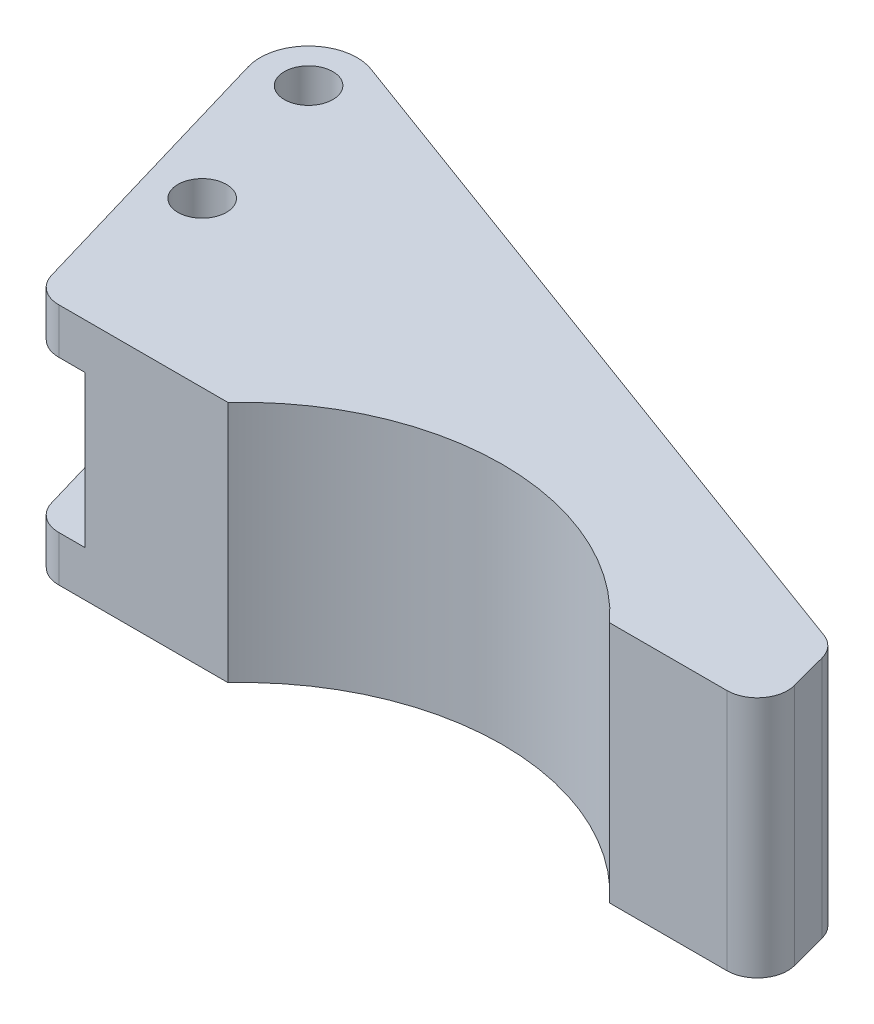
ISO-10303-21;
HEADER;
FILE_DESCRIPTION(('STEP AP214'),'2;1');
FILE_NAME('part.step','',(''),(''),'','','');
FILE_SCHEMA(('AUTOMOTIVE_DESIGN { 1 0 10303 214 1 1 1 1 }'));
ENDSEC;
DATA;
#1=APPLICATION_CONTEXT('core data for automotive mechanical design processes');
#2=APPLICATION_PROTOCOL_DEFINITION('international standard','automotive_design',2000,#1);
#3=PRODUCT_CONTEXT('',#1,'mechanical');
#4=PRODUCT('Part','Part','',(#3));
#5=PRODUCT_RELATED_PRODUCT_CATEGORY('part','',(#4));
#6=PRODUCT_DEFINITION_FORMATION('','',#4);
#7=PRODUCT_DEFINITION_CONTEXT('part definition',#1,'design');
#8=PRODUCT_DEFINITION('design','',#6,#7);
#9=PRODUCT_DEFINITION_SHAPE('','',#8);
#10=(LENGTH_UNIT() NAMED_UNIT(*) SI_UNIT(.MILLI.,.METRE.));
#11=(NAMED_UNIT(*) PLANE_ANGLE_UNIT() SI_UNIT($,.RADIAN.));
#12=(NAMED_UNIT(*) SI_UNIT($,.STERADIAN.) SOLID_ANGLE_UNIT());
#13=UNCERTAINTY_MEASURE_WITH_UNIT(LENGTH_MEASURE(1.E-05),#10,'distance_accuracy_value','');
#14=(GEOMETRIC_REPRESENTATION_CONTEXT(3) GLOBAL_UNCERTAINTY_ASSIGNED_CONTEXT((#13)) GLOBAL_UNIT_ASSIGNED_CONTEXT((#10,
#11,#12)) REPRESENTATION_CONTEXT('',''));
#15=CARTESIAN_POINT('',(0.,0.,0.));
#16=DIRECTION('',(0.,0.,1.));
#17=DIRECTION('',(1.,0.,0.));
#18=AXIS2_PLACEMENT_3D('',#15,#16,#17);
#19=CARTESIAN_POINT('',(0.,20.,0.));
#20=DIRECTION('',(0.,-1.,0.));
#21=DIRECTION('',(0.,0.,-1.));
#22=AXIS2_PLACEMENT_3D('',#19,#20,#21);
#23=CYLINDRICAL_SURFACE('',#22,8.);
#24=CARTESIAN_POINT('',(0.,-12.5,0.));
#25=DIRECTION('',(0.,-1.,0.));
#26=DIRECTION('',(0.,0.,-1.));
#27=AXIS2_PLACEMENT_3D('',#24,#25,#26);
#28=CIRCLE('',#27,8.);
#29=CARTESIAN_POINT('',(-7.67348841198962,-12.5,2.26220591261295));
#30=VERTEX_POINT('',#29);
#31=CARTESIAN_POINT('',(2.76333213161237,-12.5,-7.50759585555846));
#32=VERTEX_POINT('',#31);
#33=EDGE_CURVE('E228',#30,#32,#28,.T.);
#34=ORIENTED_EDGE('',*,*,#33,.T.);
#35=DIRECTION('',(0.,-1.,0.));
#36=VECTOR('',#35,1.);
#37=CARTESIAN_POINT('',(2.76333213161237,20.,-7.50759585555846));
#38=LINE('',#37,#36);
#39=CARTESIAN_POINT('',(2.76333213161237,-20.,-7.50759585555846));
#40=VERTEX_POINT('',#39);
#41=EDGE_CURVE('E100',#32,#40,#38,.T.);
#42=ORIENTED_EDGE('',*,*,#41,.T.);
#43=CARTESIAN_POINT('',(0.,-20.,0.));
#44=DIRECTION('',(0.,1.,0.));
#45=DIRECTION('',(0.,0.,-1.));
#46=AXIS2_PLACEMENT_3D('',#43,#44,#45);
#47=CIRCLE('',#46,8.);
#48=CARTESIAN_POINT('',(-7.67348841198962,-20.,2.26220591261295));
#49=VERTEX_POINT('',#48);
#50=EDGE_CURVE('E159',#40,#49,#47,.T.);
#51=ORIENTED_EDGE('',*,*,#50,.T.);
#52=DIRECTION('',(0.,-1.,0.));
#53=VECTOR('',#52,1.);
#54=CARTESIAN_POINT('',(-7.67348841198962,20.,2.26220591261295));
#55=LINE('',#54,#53);
#56=EDGE_CURVE('E204',#30,#49,#55,.T.);
#57=ORIENTED_EDGE('',*,*,#56,.F.);
#58=EDGE_LOOP('',(#34,#42,#51,#57));
#59=FACE_BOUND('',#58,.T.);
#60=ADVANCED_FACE('F36',(#59),#23,.T.);
#61=CARTESIAN_POINT('',(-7.67348841198962,20.,2.26220591261295));
#62=DIRECTION('',(0.959186051498703,0.,-0.282775739076619));
#63=DIRECTION('',(-0.282775739076619,0.,-0.959186051498703));
#64=AXIS2_PLACEMENT_3D('',#61,#62,#63);
#65=PLANE('',#64);
#66=CARTESIAN_POINT('',(-7.67348841198962,20.,2.26220591261295));
#67=VERTEX_POINT('',#66);
#68=CARTESIAN_POINT('',(-7.67348841198962,12.5,2.26220591261295));
#69=VERTEX_POINT('',#68);
#70=EDGE_CURVE('E44',#67,#69,#55,.T.);
#71=ORIENTED_EDGE('',*,*,#70,.T.);
#72=DIRECTION('',(0.282775739076619,0.,0.959186051498703));
#73=VECTOR('',#72,1.);
#74=CARTESIAN_POINT('',(-7.67348841198962,12.5,2.26220591261295));
#75=LINE('',#74,#73);
#76=CARTESIAN_POINT('',(5.89406974250649,12.5,48.2838786953831));
#77=VERTEX_POINT('',#76);
#78=EDGE_CURVE('E237',#69,#77,#75,.T.);
#79=ORIENTED_EDGE('',*,*,#78,.T.);
#80=DIRECTION('',(0.,-1.,0.));
#81=VECTOR('',#80,1.);
#82=CARTESIAN_POINT('',(5.89406974250649,20.,48.2838786953831));
#83=LINE('',#82,#81);
#84=CARTESIAN_POINT('',(5.89406974250649,20.,48.2838786953831));
#85=VERTEX_POINT('',#84);
#86=EDGE_CURVE('E201',#85,#77,#83,.T.);
#87=ORIENTED_EDGE('',*,*,#86,.F.);
#88=DIRECTION('',(0.282775739076619,0.,0.959186051498703));
#89=VECTOR('',#88,1.);
#90=CARTESIAN_POINT('',(-7.67348841198962,20.,2.26220591261295));
#91=LINE('',#90,#89);
#92=EDGE_CURVE('E109',#67,#85,#91,.T.);
#93=ORIENTED_EDGE('',*,*,#92,.F.);
#94=EDGE_LOOP('',(#71,#79,#87,#93));
#95=FACE_BOUND('',#94,.T.);
#96=ADVANCED_FACE('F287',(#95),#65,.F.);
#97=CARTESIAN_POINT('',(10.69,20.,46.87));
#98=DIRECTION('',(0.,-1.,0.));
#99=DIRECTION('',(0.,0.,-1.));
#100=AXIS2_PLACEMENT_3D('',#97,#98,#99);
#101=CYLINDRICAL_SURFACE('',#100,5.);
#102=ORIENTED_EDGE('',*,*,#86,.T.);
#103=CARTESIAN_POINT('',(10.69,12.5,46.87));
#104=DIRECTION('',(0.,1.,0.));
#105=DIRECTION('',(0.,0.,1.));
#106=AXIS2_PLACEMENT_3D('',#103,#104,#105);
#107=CIRCLE('',#106,5.);
#108=CARTESIAN_POINT('',(10.69,12.5,51.87));
#109=VERTEX_POINT('',#108);
#110=EDGE_CURVE('E240',#77,#109,#107,.T.);
#111=ORIENTED_EDGE('',*,*,#110,.T.);
#112=DIRECTION('',(0.,-1.,0.));
#113=VECTOR('',#112,1.);
#114=CARTESIAN_POINT('',(10.69,20.,51.87));
#115=LINE('',#114,#113);
#116=CARTESIAN_POINT('',(10.69,20.,51.87));
#117=VERTEX_POINT('',#116);
#118=EDGE_CURVE('E197',#117,#109,#115,.T.);
#119=ORIENTED_EDGE('',*,*,#118,.F.);
#120=CARTESIAN_POINT('',(10.69,20.,46.87));
#121=DIRECTION('',(0.,1.,0.));
#122=DIRECTION('',(0.,0.,1.));
#123=AXIS2_PLACEMENT_3D('',#120,#121,#122);
#124=CIRCLE('',#123,5.);
#125=EDGE_CURVE('E256',#85,#117,#124,.T.);
#126=ORIENTED_EDGE('',*,*,#125,.F.);
#127=EDGE_LOOP('',(#102,#111,#119,#126));
#128=FACE_BOUND('',#127,.T.);
#129=ADVANCED_FACE('F290',(#128),#101,.T.);
#130=CARTESIAN_POINT('',(0.,20.,0.));
#131=DIRECTION('',(0.,-1.,0.));
#132=DIRECTION('',(0.,0.,-1.));
#133=AXIS2_PLACEMENT_3D('',#130,#131,#132);
#134=CYLINDRICAL_SURFACE('',#133,4.);
#135=CARTESIAN_POINT('',(0.,12.5,0.));
#136=DIRECTION('',(0.,1.,0.));
#137=DIRECTION('',(0.,0.,1.));
#138=AXIS2_PLACEMENT_3D('',#135,#136,#137);
#139=CIRCLE('',#138,4.);
#140=CARTESIAN_POINT('',(0.,12.5,4.));
#141=VERTEX_POINT('',#140);
#142=EDGE_CURVE('E212',#141,#141,#139,.T.);
#143=ORIENTED_EDGE('',*,*,#142,.F.);
#144=EDGE_LOOP('',(#143));
#145=FACE_BOUND('',#144,.T.);
#146=CARTESIAN_POINT('',(0.,20.,0.));
#147=DIRECTION('',(0.,1.,0.));
#148=DIRECTION('',(0.,0.,1.));
#149=AXIS2_PLACEMENT_3D('',#146,#147,#148);
#150=CIRCLE('',#149,4.);
#151=CARTESIAN_POINT('',(0.,20.,4.));
#152=VERTEX_POINT('',#151);
#153=EDGE_CURVE('E162',#152,#152,#150,.T.);
#154=ORIENTED_EDGE('',*,*,#153,.T.);
#155=EDGE_LOOP('',(#154));
#156=FACE_BOUND('',#155,.T.);
#157=ADVANCED_FACE('F396',(#145,#156),#134,.F.);
#158=CARTESIAN_POINT('',(7.33,20.,24.87));
#159=DIRECTION('',(0.,-1.,0.));
#160=DIRECTION('',(0.,0.,-1.));
#161=AXIS2_PLACEMENT_3D('',#158,#159,#160);
#162=CYLINDRICAL_SURFACE('',#161,4.);
#163=CARTESIAN_POINT('',(7.33,12.5,24.87));
#164=DIRECTION('',(0.,1.,0.));
#165=DIRECTION('',(0.,0.,1.));
#166=AXIS2_PLACEMENT_3D('',#163,#164,#165);
#167=CIRCLE('',#166,4.);
#168=CARTESIAN_POINT('',(7.33,12.5,28.87));
#169=VERTEX_POINT('',#168);
#170=EDGE_CURVE('E210',#169,#169,#167,.T.);
#171=ORIENTED_EDGE('',*,*,#170,.F.);
#172=EDGE_LOOP('',(#171));
#173=FACE_BOUND('',#172,.T.);
#174=CARTESIAN_POINT('',(7.33,20.,24.87));
#175=DIRECTION('',(0.,1.,0.));
#176=DIRECTION('',(0.,0.,1.));
#177=AXIS2_PLACEMENT_3D('',#174,#175,#176);
#178=CIRCLE('',#177,4.);
#179=CARTESIAN_POINT('',(7.33,20.,28.87));
#180=VERTEX_POINT('',#179);
#181=EDGE_CURVE('E244',#180,#180,#178,.T.);
#182=ORIENTED_EDGE('',*,*,#181,.T.);
#183=EDGE_LOOP('',(#182));
#184=FACE_BOUND('',#183,.T.);
#185=ADVANCED_FACE('F373',(#173,#184),#162,.F.);
#186=CARTESIAN_POINT('',(0.,20.,0.));
#187=DIRECTION('',(0.,-1.,0.));
#188=DIRECTION('',(0.,0.,-1.));
#189=AXIS2_PLACEMENT_3D('',#186,#187,#188);
#190=PLANE('',#189);
#191=CARTESIAN_POINT('',(0.,20.,0.));
#192=DIRECTION('',(0.,1.,0.));
#193=DIRECTION('',(0.,0.,-1.));
#194=AXIS2_PLACEMENT_3D('',#191,#192,#193);
#195=CIRCLE('',#194,8.);
#196=CARTESIAN_POINT('',(2.76333213161237,20.,-7.50759585555846));
#197=VERTEX_POINT('',#196);
#198=EDGE_CURVE('E181',#197,#67,#195,.T.);
#199=ORIENTED_EDGE('',*,*,#198,.T.);
#200=ORIENTED_EDGE('',*,*,#92,.T.);
#201=ORIENTED_EDGE('',*,*,#125,.T.);
#202=DIRECTION('',(1.,0.,0.));
#203=VECTOR('',#202,1.);
#204=CARTESIAN_POINT('',(10.69,20.,51.87));
#205=LINE('',#204,#203);
#206=CARTESIAN_POINT('',(38.5852070424872,20.,51.87));
#207=VERTEX_POINT('',#206);
#208=EDGE_CURVE('E258',#117,#207,#205,.T.);
#209=ORIENTED_EDGE('',*,*,#208,.T.);
#210=CARTESIAN_POINT('',(70.04,20.,80.88));
#211=DIRECTION('',(0.,-1.,0.));
#212=DIRECTION('',(0.,0.,-1.));
#213=AXIS2_PLACEMENT_3D('',#210,#211,#212);
#214=CIRCLE('',#213,42.79);
#215=CARTESIAN_POINT('',(101.494792957513,20.,51.87));
#216=VERTEX_POINT('',#215);
#217=EDGE_CURVE('E260',#207,#216,#214,.T.);
#218=ORIENTED_EDGE('',*,*,#217,.T.);
#219=DIRECTION('',(1.,0.,0.));
#220=VECTOR('',#219,1.);
#221=CARTESIAN_POINT('',(101.494792957513,20.,51.87));
#222=LINE('',#221,#220);
#223=CARTESIAN_POINT('',(120.83,20.,51.87));
#224=VERTEX_POINT('',#223);
#225=EDGE_CURVE('E262',#216,#224,#222,.T.);
#226=ORIENTED_EDGE('',*,*,#225,.T.);
#227=CARTESIAN_POINT('',(120.83,20.,46.87));
#228=DIRECTION('',(0.,1.,0.));
#229=DIRECTION('',(0.,0.,1.));
#230=AXIS2_PLACEMENT_3D('',#227,#228,#229);
#231=CIRCLE('',#230,5.00000000000001);
#232=CARTESIAN_POINT('',(125.661820832769,20.,45.584112197731));
#233=VERTEX_POINT('',#232);
#234=EDGE_CURVE('E138',#224,#233,#231,.T.);
#235=ORIENTED_EDGE('',*,*,#234,.T.);
#236=DIRECTION('',(-0.257177560453807,0.,-0.966364166553701));
#237=VECTOR('',#236,1.);
#238=CARTESIAN_POINT('',(125.661820832769,20.,45.584112197731));
#239=LINE('',#238,#237);
#240=CARTESIAN_POINT('',(124.011820832769,20.,39.384112197731));
#241=VERTEX_POINT('',#240);
#242=EDGE_CURVE('E130',#233,#241,#239,.T.);
#243=ORIENTED_EDGE('',*,*,#242,.T.);
#244=CARTESIAN_POINT('',(119.18,20.,40.67));
#245=DIRECTION('',(0.,1.,0.));
#246=DIRECTION('',(0.,0.,1.));
#247=AXIS2_PLACEMENT_3D('',#244,#245,#246);
#248=CIRCLE('',#247,5.00000000000002);
#249=CARTESIAN_POINT('',(120.907082582258,20.,35.9777525902759));
#250=VERTEX_POINT('',#249);
#251=EDGE_CURVE('E135',#241,#250,#248,.T.);
#252=ORIENTED_EDGE('',*,*,#251,.T.);
#253=DIRECTION('',(-0.938449481944808,0.,-0.345416516451547));
#254=VECTOR('',#253,1.);
#255=CARTESIAN_POINT('',(120.907082582258,20.,35.977752590276));
#256=LINE('',#255,#254);
#257=EDGE_CURVE('E60',#250,#197,#256,.T.);
#258=ORIENTED_EDGE('',*,*,#257,.T.);
#259=EDGE_LOOP('',(#199,#200,#201,#209,#218,#226,#235,#243,#252,#258));
#260=FACE_BOUND('',#259,.T.);
#261=ORIENTED_EDGE('',*,*,#153,.F.);
#262=EDGE_LOOP('',(#261));
#263=FACE_BOUND('',#262,.T.);
#264=ORIENTED_EDGE('',*,*,#181,.F.);
#265=EDGE_LOOP('',(#264));
#266=FACE_BOUND('',#265,.T.);
#267=ADVANCED_FACE('F132',(#260,#263,#266),#190,.F.);
#268=CARTESIAN_POINT('',(0.,-20.,0.));
#269=DIRECTION('',(0.,-1.,0.));
#270=DIRECTION('',(0.,0.,-1.));
#271=AXIS2_PLACEMENT_3D('',#268,#269,#270);
#272=PLANE('',#271);
#273=CARTESIAN_POINT('',(0.,-20.,0.));
#274=DIRECTION('',(0.,1.,0.));
#275=DIRECTION('',(0.,0.,1.));
#276=AXIS2_PLACEMENT_3D('',#273,#274,#275);
#277=CIRCLE('',#276,4.);
#278=CARTESIAN_POINT('',(0.,-20.,4.));
#279=VERTEX_POINT('',#278);
#280=EDGE_CURVE('E247',#279,#279,#277,.T.);
#281=ORIENTED_EDGE('',*,*,#280,.T.);
#282=EDGE_LOOP('',(#281));
#283=FACE_BOUND('',#282,.T.);
#284=ORIENTED_EDGE('',*,*,#50,.F.);
#285=DIRECTION('',(-0.938449481944808,0.,-0.345416516451547));
#286=VECTOR('',#285,1.);
#287=CARTESIAN_POINT('',(120.907082582258,-20.,35.977752590276));
#288=LINE('',#287,#286);
#289=CARTESIAN_POINT('',(120.907082582258,-20.,35.9777525902759));
#290=VERTEX_POINT('',#289);
#291=EDGE_CURVE('E179',#290,#40,#288,.T.);
#292=ORIENTED_EDGE('',*,*,#291,.F.);
#293=CARTESIAN_POINT('',(119.18,-20.,40.67));
#294=DIRECTION('',(0.,1.,0.));
#295=DIRECTION('',(0.,0.,1.));
#296=AXIS2_PLACEMENT_3D('',#293,#294,#295);
#297=CIRCLE('',#296,5.00000000000002);
#298=CARTESIAN_POINT('',(124.011820832769,-20.,39.384112197731));
#299=VERTEX_POINT('',#298);
#300=EDGE_CURVE('E177',#299,#290,#297,.T.);
#301=ORIENTED_EDGE('',*,*,#300,.F.);
#302=DIRECTION('',(-0.257177560453807,0.,-0.966364166553701));
#303=VECTOR('',#302,1.);
#304=CARTESIAN_POINT('',(125.661820832769,-20.,45.584112197731));
#305=LINE('',#304,#303);
#306=CARTESIAN_POINT('',(125.661820832769,-20.,45.584112197731));
#307=VERTEX_POINT('',#306);
#308=EDGE_CURVE('E147',#307,#299,#305,.T.);
#309=ORIENTED_EDGE('',*,*,#308,.F.);
#310=CARTESIAN_POINT('',(120.83,-20.,46.87));
#311=DIRECTION('',(0.,1.,0.));
#312=DIRECTION('',(0.,0.,1.));
#313=AXIS2_PLACEMENT_3D('',#310,#311,#312);
#314=CIRCLE('',#313,5.00000000000001);
#315=CARTESIAN_POINT('',(120.83,-20.,51.87));
#316=VERTEX_POINT('',#315);
#317=EDGE_CURVE('E174',#316,#307,#314,.T.);
#318=ORIENTED_EDGE('',*,*,#317,.F.);
#319=DIRECTION('',(1.,0.,0.));
#320=VECTOR('',#319,1.);
#321=CARTESIAN_POINT('',(101.494792957513,-20.,51.87));
#322=LINE('',#321,#320);
#323=CARTESIAN_POINT('',(101.494792957513,-20.,51.87));
#324=VERTEX_POINT('',#323);
#325=EDGE_CURVE('E172',#324,#316,#322,.T.);
#326=ORIENTED_EDGE('',*,*,#325,.F.);
#327=CARTESIAN_POINT('',(70.04,-20.,80.88));
#328=DIRECTION('',(0.,-1.,0.));
#329=DIRECTION('',(0.,0.,-1.));
#330=AXIS2_PLACEMENT_3D('',#327,#328,#329);
#331=CIRCLE('',#330,42.79);
#332=CARTESIAN_POINT('',(38.5852070424872,-20.,51.87));
#333=VERTEX_POINT('',#332);
#334=EDGE_CURVE('E170',#333,#324,#331,.T.);
#335=ORIENTED_EDGE('',*,*,#334,.F.);
#336=DIRECTION('',(1.,0.,0.));
#337=VECTOR('',#336,1.);
#338=CARTESIAN_POINT('',(10.69,-20.,51.87));
#339=LINE('',#338,#337);
#340=CARTESIAN_POINT('',(10.69,-20.,51.87));
#341=VERTEX_POINT('',#340);
#342=EDGE_CURVE('E168',#341,#333,#339,.T.);
#343=ORIENTED_EDGE('',*,*,#342,.F.);
#344=CARTESIAN_POINT('',(10.69,-20.,46.87));
#345=DIRECTION('',(0.,1.,0.));
#346=DIRECTION('',(0.,0.,1.));
#347=AXIS2_PLACEMENT_3D('',#344,#345,#346);
#348=CIRCLE('',#347,5.);
#349=CARTESIAN_POINT('',(5.89406974250649,-20.,48.2838786953831));
#350=VERTEX_POINT('',#349);
#351=EDGE_CURVE('E165',#350,#341,#348,.T.);
#352=ORIENTED_EDGE('',*,*,#351,.F.);
#353=DIRECTION('',(0.282775739076619,0.,0.959186051498703));
#354=VECTOR('',#353,1.);
#355=CARTESIAN_POINT('',(-7.67348841198962,-20.,2.26220591261295));
#356=LINE('',#355,#354);
#357=EDGE_CURVE('E161',#49,#350,#356,.T.);
#358=ORIENTED_EDGE('',*,*,#357,.F.);
#359=EDGE_LOOP('',(#284,#292,#301,#309,#318,#326,#335,#343,#352,#358));
#360=FACE_BOUND('',#359,.T.);
#361=CARTESIAN_POINT('',(7.33,-20.,24.87));
#362=DIRECTION('',(0.,1.,0.));
#363=DIRECTION('',(0.,0.,1.));
#364=AXIS2_PLACEMENT_3D('',#361,#362,#363);
#365=CIRCLE('',#364,4.);
#366=CARTESIAN_POINT('',(7.33,-20.,28.87));
#367=VERTEX_POINT('',#366);
#368=EDGE_CURVE('E243',#367,#367,#365,.T.);
#369=ORIENTED_EDGE('',*,*,#368,.T.);
#370=EDGE_LOOP('',(#369));
#371=FACE_BOUND('',#370,.T.);
#372=ADVANCED_FACE('F275',(#283,#360,#371),#272,.T.);
#373=CARTESIAN_POINT('',(0.,12.5,0.));
#374=DIRECTION('',(0.,1.,0.));
#375=DIRECTION('',(0.,0.,1.));
#376=AXIS2_PLACEMENT_3D('',#373,#374,#375);
#377=CIRCLE('',#376,8.);
#378=CARTESIAN_POINT('',(2.76333213161237,12.5,-7.50759585555846));
#379=VERTEX_POINT('',#378);
#380=EDGE_CURVE('E234',#379,#69,#377,.T.);
#381=ORIENTED_EDGE('',*,*,#380,.T.);
#382=ORIENTED_EDGE('',*,*,#70,.F.);
#383=ORIENTED_EDGE('',*,*,#198,.F.);
#384=EDGE_CURVE('E182',#197,#379,#38,.T.);
#385=ORIENTED_EDGE('',*,*,#384,.T.);
#386=EDGE_LOOP('',(#381,#382,#383,#385));
#387=FACE_BOUND('',#386,.T.);
#388=ADVANCED_FACE('F38',(#387),#23,.T.);
#389=CARTESIAN_POINT('',(5.89406974250649,-12.5,48.2838786953831));
#390=VERTEX_POINT('',#389);
#391=EDGE_CURVE('E200',#390,#350,#83,.T.);
#392=ORIENTED_EDGE('',*,*,#391,.F.);
#393=DIRECTION('',(-0.282775739076619,0.,-0.959186051498703));
#394=VECTOR('',#393,1.);
#395=CARTESIAN_POINT('',(-7.67348841198962,-12.5,2.26220591261295));
#396=LINE('',#395,#394);
#397=EDGE_CURVE('E220',#390,#30,#396,.T.);
#398=ORIENTED_EDGE('',*,*,#397,.T.);
#399=ORIENTED_EDGE('',*,*,#56,.T.);
#400=ORIENTED_EDGE('',*,*,#357,.T.);
#401=EDGE_LOOP('',(#392,#398,#399,#400));
#402=FACE_BOUND('',#401,.T.);
#403=ADVANCED_FACE('F307',(#402),#65,.F.);
#404=CARTESIAN_POINT('',(10.69,-12.5,51.87));
#405=VERTEX_POINT('',#404);
#406=EDGE_CURVE('E196',#405,#341,#115,.T.);
#407=ORIENTED_EDGE('',*,*,#406,.F.);
#408=CARTESIAN_POINT('',(10.69,-12.5,46.87));
#409=DIRECTION('',(0.,-1.,0.));
#410=DIRECTION('',(0.,0.,-1.));
#411=AXIS2_PLACEMENT_3D('',#408,#409,#410);
#412=CIRCLE('',#411,5.);
#413=EDGE_CURVE('E213',#405,#390,#412,.T.);
#414=ORIENTED_EDGE('',*,*,#413,.T.);
#415=ORIENTED_EDGE('',*,*,#391,.T.);
#416=ORIENTED_EDGE('',*,*,#351,.T.);
#417=EDGE_LOOP('',(#407,#414,#415,#416));
#418=FACE_BOUND('',#417,.T.);
#419=ADVANCED_FACE('F304',(#418),#101,.T.);
#420=CARTESIAN_POINT('',(10.69,20.,51.87));
#421=DIRECTION('',(0.,0.,-1.));
#422=DIRECTION('',(-1.,0.,0.));
#423=AXIS2_PLACEMENT_3D('',#420,#421,#422);
#424=PLANE('',#423);
#425=ORIENTED_EDGE('',*,*,#118,.T.);
#426=DIRECTION('',(-1.,0.,0.));
#427=VECTOR('',#426,1.);
#428=CARTESIAN_POINT('',(-8.,12.5,51.87));
#429=LINE('',#428,#427);
#430=CARTESIAN_POINT('',(15.,12.5,51.87));
#431=VERTEX_POINT('',#430);
#432=EDGE_CURVE('E327',#431,#109,#429,.T.);
#433=ORIENTED_EDGE('',*,*,#432,.F.);
#434=DIRECTION('',(0.,1.,0.));
#435=VECTOR('',#434,1.);
#436=CARTESIAN_POINT('',(15.,12.5,51.87));
#437=LINE('',#436,#435);
#438=CARTESIAN_POINT('',(15.,-12.5,51.87));
#439=VERTEX_POINT('',#438);
#440=EDGE_CURVE('E332',#439,#431,#437,.T.);
#441=ORIENTED_EDGE('',*,*,#440,.F.);
#442=DIRECTION('',(1.,0.,0.));
#443=VECTOR('',#442,1.);
#444=CARTESIAN_POINT('',(-8.,-12.5,51.87));
#445=LINE('',#444,#443);
#446=EDGE_CURVE('E335',#405,#439,#445,.T.);
#447=ORIENTED_EDGE('',*,*,#446,.F.);
#448=ORIENTED_EDGE('',*,*,#406,.T.);
#449=ORIENTED_EDGE('',*,*,#342,.T.);
#450=DIRECTION('',(0.,-1.,0.));
#451=VECTOR('',#450,1.);
#452=CARTESIAN_POINT('',(38.5852070424872,20.,51.87));
#453=LINE('',#452,#451);
#454=EDGE_CURVE('E193',#207,#333,#453,.T.);
#455=ORIENTED_EDGE('',*,*,#454,.F.);
#456=ORIENTED_EDGE('',*,*,#208,.F.);
#457=EDGE_LOOP('',(#425,#433,#441,#447,#448,#449,#455,#456));
#458=FACE_BOUND('',#457,.T.);
#459=ADVANCED_FACE('F297',(#458),#424,.F.);
#460=CARTESIAN_POINT('',(70.04,20.,80.88));
#461=DIRECTION('',(0.,-1.,0.));
#462=DIRECTION('',(0.,0.,-1.));
#463=AXIS2_PLACEMENT_3D('',#460,#461,#462);
#464=CYLINDRICAL_SURFACE('',#463,42.79);
#465=ORIENTED_EDGE('',*,*,#334,.T.);
#466=DIRECTION('',(0.,-1.,0.));
#467=VECTOR('',#466,1.);
#468=CARTESIAN_POINT('',(101.494792957513,20.,51.87));
#469=LINE('',#468,#467);
#470=EDGE_CURVE('E190',#216,#324,#469,.T.);
#471=ORIENTED_EDGE('',*,*,#470,.F.);
#472=ORIENTED_EDGE('',*,*,#217,.F.);
#473=ORIENTED_EDGE('',*,*,#454,.T.);
#474=EDGE_LOOP('',(#465,#471,#472,#473));
#475=FACE_BOUND('',#474,.T.);
#476=ADVANCED_FACE('F301',(#475),#464,.F.);
#477=CARTESIAN_POINT('',(101.494792957513,20.,51.87));
#478=DIRECTION('',(0.,0.,-1.));
#479=DIRECTION('',(-1.,0.,0.));
#480=AXIS2_PLACEMENT_3D('',#477,#478,#479);
#481=PLANE('',#480);
#482=ORIENTED_EDGE('',*,*,#325,.T.);
#483=DIRECTION('',(0.,-1.,0.));
#484=VECTOR('',#483,1.);
#485=CARTESIAN_POINT('',(120.83,20.,51.87));
#486=LINE('',#485,#484);
#487=EDGE_CURVE('E187',#224,#316,#486,.T.);
#488=ORIENTED_EDGE('',*,*,#487,.F.);
#489=ORIENTED_EDGE('',*,*,#225,.F.);
#490=ORIENTED_EDGE('',*,*,#470,.T.);
#491=EDGE_LOOP('',(#482,#488,#489,#490));
#492=FACE_BOUND('',#491,.T.);
#493=ADVANCED_FACE('F268',(#492),#481,.F.);
#494=CARTESIAN_POINT('',(120.83,20.,46.87));
#495=DIRECTION('',(0.,-1.,0.));
#496=DIRECTION('',(0.,0.,-1.));
#497=AXIS2_PLACEMENT_3D('',#494,#495,#496);
#498=CYLINDRICAL_SURFACE('',#497,5.00000000000001);
#499=ORIENTED_EDGE('',*,*,#317,.T.);
#500=DIRECTION('',(0.,-1.,0.));
#501=VECTOR('',#500,1.);
#502=CARTESIAN_POINT('',(125.661820832769,20.,45.584112197731));
#503=LINE('',#502,#501);
#504=EDGE_CURVE('E150',#233,#307,#503,.T.);
#505=ORIENTED_EDGE('',*,*,#504,.F.);
#506=ORIENTED_EDGE('',*,*,#234,.F.);
#507=ORIENTED_EDGE('',*,*,#487,.T.);
#508=EDGE_LOOP('',(#499,#505,#506,#507));
#509=FACE_BOUND('',#508,.T.);
#510=ADVANCED_FACE('F272',(#509),#498,.T.);
#511=CARTESIAN_POINT('',(125.661820832769,20.,45.584112197731));
#512=DIRECTION('',(-0.966364166553701,0.,0.257177560453807));
#513=DIRECTION('',(0.257177560453807,0.,0.966364166553701));
#514=AXIS2_PLACEMENT_3D('',#511,#512,#513);
#515=PLANE('',#514);
#516=ORIENTED_EDGE('',*,*,#308,.T.);
#517=DIRECTION('',(0.,-1.,0.));
#518=VECTOR('',#517,1.);
#519=CARTESIAN_POINT('',(124.011820832769,20.,39.384112197731));
#520=LINE('',#519,#518);
#521=EDGE_CURVE('E144',#241,#299,#520,.T.);
#522=ORIENTED_EDGE('',*,*,#521,.F.);
#523=ORIENTED_EDGE('',*,*,#242,.F.);
#524=ORIENTED_EDGE('',*,*,#504,.T.);
#525=EDGE_LOOP('',(#516,#522,#523,#524));
#526=FACE_BOUND('',#525,.T.);
#527=ADVANCED_FACE('F145',(#526),#515,.F.);
#528=CARTESIAN_POINT('',(119.18,20.,40.67));
#529=DIRECTION('',(0.,-1.,0.));
#530=DIRECTION('',(0.,0.,-1.));
#531=AXIS2_PLACEMENT_3D('',#528,#529,#530);
#532=CYLINDRICAL_SURFACE('',#531,5.00000000000002);
#533=ORIENTED_EDGE('',*,*,#300,.T.);
#534=DIRECTION('',(0.,-1.,0.));
#535=VECTOR('',#534,1.);
#536=CARTESIAN_POINT('',(120.907082582258,20.,35.9777525902759));
#537=LINE('',#536,#535);
#538=EDGE_CURVE('E151',#250,#290,#537,.T.);
#539=ORIENTED_EDGE('',*,*,#538,.F.);
#540=ORIENTED_EDGE('',*,*,#251,.F.);
#541=ORIENTED_EDGE('',*,*,#521,.T.);
#542=EDGE_LOOP('',(#533,#539,#540,#541));
#543=FACE_BOUND('',#542,.T.);
#544=ADVANCED_FACE('F153',(#543),#532,.T.);
#545=CARTESIAN_POINT('',(120.907082582258,20.,35.977752590276));
#546=DIRECTION('',(-0.345416516451547,0.,0.938449481944808));
#547=DIRECTION('',(0.938449481944808,0.,0.345416516451547));
#548=AXIS2_PLACEMENT_3D('',#545,#546,#547);
#549=PLANE('',#548);
#550=DIRECTION('',(0.,1.,0.));
#551=VECTOR('',#550,1.);
#552=CARTESIAN_POINT('',(15.,20.,-3.00362705447428));
#553=LINE('',#552,#551);
#554=CARTESIAN_POINT('',(15.,-12.5,-3.00362705447428));
#555=VERTEX_POINT('',#554);
#556=CARTESIAN_POINT('',(15.,12.5,-3.00362705447428));
#557=VERTEX_POINT('',#556);
#558=EDGE_CURVE('E11',#555,#557,#553,.T.);
#559=ORIENTED_EDGE('',*,*,#558,.T.);
#560=DIRECTION('',(-0.938449481944808,0.,-0.345416516451547));
#561=VECTOR('',#560,1.);
#562=CARTESIAN_POINT('',(120.907082582258,12.5,35.977752590276));
#563=LINE('',#562,#561);
#564=EDGE_CURVE('E217',#557,#379,#563,.T.);
#565=ORIENTED_EDGE('',*,*,#564,.T.);
#566=ORIENTED_EDGE('',*,*,#384,.F.);
#567=ORIENTED_EDGE('',*,*,#257,.F.);
#568=ORIENTED_EDGE('',*,*,#538,.T.);
#569=ORIENTED_EDGE('',*,*,#291,.T.);
#570=ORIENTED_EDGE('',*,*,#41,.F.);
#571=DIRECTION('',(0.938449481944808,0.,0.345416516451547));
#572=VECTOR('',#571,1.);
#573=CARTESIAN_POINT('',(120.907082582258,-12.5,35.977752590276));
#574=LINE('',#573,#572);
#575=EDGE_CURVE('E342',#32,#555,#574,.T.);
#576=ORIENTED_EDGE('',*,*,#575,.T.);
#577=EDGE_LOOP('',(#559,#565,#566,#567,#568,#569,#570,#576));
#578=FACE_BOUND('',#577,.T.);
#579=ADVANCED_FACE('F279',(#578),#549,.F.);
#580=CARTESIAN_POINT('',(0.,-12.5,0.));
#581=DIRECTION('',(0.,-1.,0.));
#582=DIRECTION('',(0.,0.,-1.));
#583=AXIS2_PLACEMENT_3D('',#580,#581,#582);
#584=CIRCLE('',#583,4.);
#585=CARTESIAN_POINT('',(0.,-12.5,-4.));
#586=VERTEX_POINT('',#585);
#587=EDGE_CURVE('E208',#586,#586,#584,.T.);
#588=ORIENTED_EDGE('',*,*,#587,.F.);
#589=EDGE_LOOP('',(#588));
#590=FACE_BOUND('',#589,.T.);
#591=ORIENTED_EDGE('',*,*,#280,.F.);
#592=EDGE_LOOP('',(#591));
#593=FACE_BOUND('',#592,.T.);
#594=ADVANCED_FACE('F379',(#590,#593),#134,.F.);
#595=CARTESIAN_POINT('',(7.33,-12.5,24.87));
#596=DIRECTION('',(0.,-1.,0.));
#597=DIRECTION('',(0.,0.,-1.));
#598=AXIS2_PLACEMENT_3D('',#595,#596,#597);
#599=CIRCLE('',#598,4.);
#600=CARTESIAN_POINT('',(7.33,-12.5,20.87));
#601=VERTEX_POINT('',#600);
#602=EDGE_CURVE('E206',#601,#601,#599,.T.);
#603=ORIENTED_EDGE('',*,*,#602,.F.);
#604=EDGE_LOOP('',(#603));
#605=FACE_BOUND('',#604,.T.);
#606=ORIENTED_EDGE('',*,*,#368,.F.);
#607=EDGE_LOOP('',(#606));
#608=FACE_BOUND('',#607,.T.);
#609=ADVANCED_FACE('F405',(#605,#608),#162,.F.);
#610=CARTESIAN_POINT('',(15.,12.5,-8.));
#611=DIRECTION('',(1.,0.,0.));
#612=DIRECTION('',(0.,0.,-1.));
#613=AXIS2_PLACEMENT_3D('',#610,#611,#612);
#614=PLANE('',#613);
#615=DIRECTION('',(0.,0.,1.));
#616=VECTOR('',#615,1.);
#617=CARTESIAN_POINT('',(15.,-12.5,-8.));
#618=LINE('',#617,#616);
#619=EDGE_CURVE('E51',#555,#439,#618,.T.);
#620=ORIENTED_EDGE('',*,*,#619,.T.);
#621=ORIENTED_EDGE('',*,*,#440,.T.);
#622=DIRECTION('',(0.,0.,1.));
#623=VECTOR('',#622,1.);
#624=CARTESIAN_POINT('',(15.,12.5,-8.));
#625=LINE('',#624,#623);
#626=EDGE_CURVE('E209',#557,#431,#625,.T.);
#627=ORIENTED_EDGE('',*,*,#626,.F.);
#628=ORIENTED_EDGE('',*,*,#558,.F.);
#629=EDGE_LOOP('',(#620,#621,#627,#628));
#630=FACE_BOUND('',#629,.T.);
#631=ADVANCED_FACE('F353',(#630),#614,.F.);
#632=CARTESIAN_POINT('',(-8.,12.5,-8.));
#633=DIRECTION('',(0.,1.,0.));
#634=DIRECTION('',(0.,0.,1.));
#635=AXIS2_PLACEMENT_3D('',#632,#633,#634);
#636=PLANE('',#635);
#637=ORIENTED_EDGE('',*,*,#142,.T.);
#638=EDGE_LOOP('',(#637));
#639=FACE_BOUND('',#638,.T.);
#640=ORIENTED_EDGE('',*,*,#170,.T.);
#641=EDGE_LOOP('',(#640));
#642=FACE_BOUND('',#641,.T.);
#643=ORIENTED_EDGE('',*,*,#78,.F.);
#644=ORIENTED_EDGE('',*,*,#380,.F.);
#645=ORIENTED_EDGE('',*,*,#564,.F.);
#646=ORIENTED_EDGE('',*,*,#626,.T.);
#647=ORIENTED_EDGE('',*,*,#432,.T.);
#648=ORIENTED_EDGE('',*,*,#110,.F.);
#649=EDGE_LOOP('',(#643,#644,#645,#646,#647,#648));
#650=FACE_BOUND('',#649,.T.);
#651=ADVANCED_FACE('F325',(#639,#642,#650),#636,.F.);
#652=CARTESIAN_POINT('',(-8.,-12.5,-8.));
#653=DIRECTION('',(0.,-1.,0.));
#654=DIRECTION('',(0.,0.,-1.));
#655=AXIS2_PLACEMENT_3D('',#652,#653,#654);
#656=PLANE('',#655);
#657=ORIENTED_EDGE('',*,*,#587,.T.);
#658=EDGE_LOOP('',(#657));
#659=FACE_BOUND('',#658,.T.);
#660=ORIENTED_EDGE('',*,*,#602,.T.);
#661=EDGE_LOOP('',(#660));
#662=FACE_BOUND('',#661,.T.);
#663=ORIENTED_EDGE('',*,*,#446,.T.);
#664=ORIENTED_EDGE('',*,*,#619,.F.);
#665=ORIENTED_EDGE('',*,*,#575,.F.);
#666=ORIENTED_EDGE('',*,*,#33,.F.);
#667=ORIENTED_EDGE('',*,*,#397,.F.);
#668=ORIENTED_EDGE('',*,*,#413,.F.);
#669=EDGE_LOOP('',(#663,#664,#665,#666,#667,#668));
#670=FACE_BOUND('',#669,.T.);
#671=ADVANCED_FACE('F344',(#659,#662,#670),#656,.F.);
#672=CLOSED_SHELL('',(#60,#96,#129,#157,#185,#267,#372,#388,#403,#419,#459,#476,#493,#510,#527,
#544,#579,#594,#609,#631,#651,#671));
#673=MANIFOLD_SOLID_BREP('B2',#672);
#674=ADVANCED_BREP_SHAPE_REPRESENTATION('',(#18,#673),#14);
#675=SHAPE_DEFINITION_REPRESENTATION(#9,#674);
ENDSEC;
END-ISO-10303-21;
